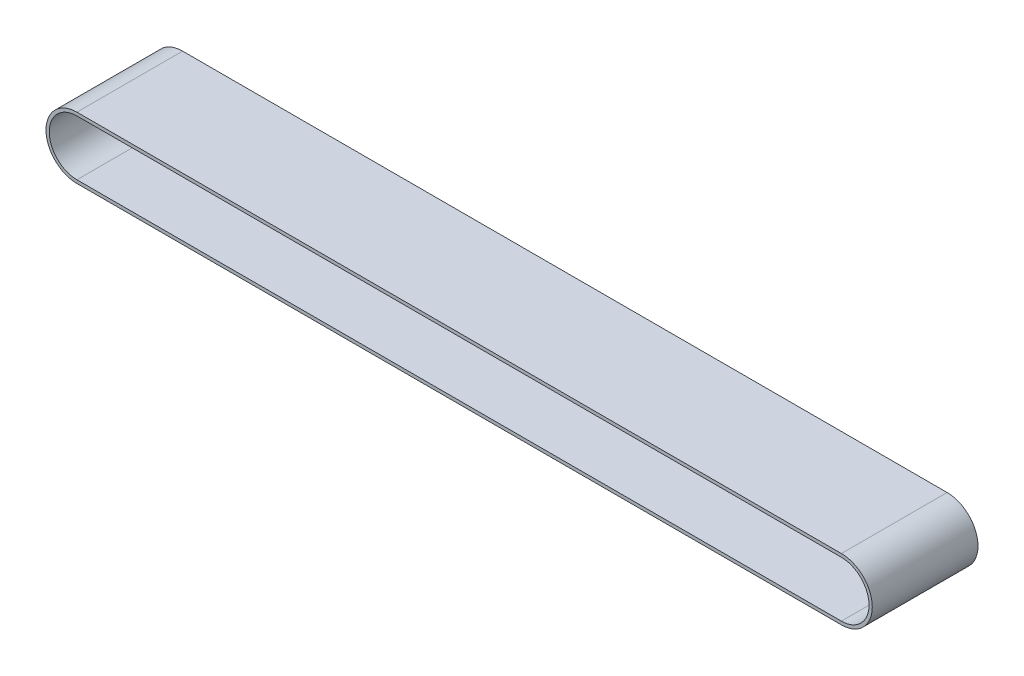
ISO-10303-21;
HEADER;
FILE_DESCRIPTION(('STEP AP214'),'2;1');
FILE_NAME('part.step','',(''),(''),'','','');
FILE_SCHEMA(('AUTOMOTIVE_DESIGN { 1 0 10303 214 1 1 1 1 }'));
ENDSEC;
DATA;
#1=APPLICATION_CONTEXT('core data for automotive mechanical design processes');
#2=APPLICATION_PROTOCOL_DEFINITION('international standard','automotive_design',2000,#1);
#3=PRODUCT_CONTEXT('',#1,'mechanical');
#4=PRODUCT('Part','Part','',(#3));
#5=PRODUCT_RELATED_PRODUCT_CATEGORY('part','',(#4));
#6=PRODUCT_DEFINITION_FORMATION('','',#4);
#7=PRODUCT_DEFINITION_CONTEXT('part definition',#1,'design');
#8=PRODUCT_DEFINITION('design','',#6,#7);
#9=PRODUCT_DEFINITION_SHAPE('','',#8);
#10=(LENGTH_UNIT() NAMED_UNIT(*) SI_UNIT(.MILLI.,.METRE.));
#11=(NAMED_UNIT(*) PLANE_ANGLE_UNIT() SI_UNIT($,.RADIAN.));
#12=(NAMED_UNIT(*) SI_UNIT($,.STERADIAN.) SOLID_ANGLE_UNIT());
#13=UNCERTAINTY_MEASURE_WITH_UNIT(LENGTH_MEASURE(1.E-05),#10,'distance_accuracy_value','');
#14=(GEOMETRIC_REPRESENTATION_CONTEXT(3) GLOBAL_UNCERTAINTY_ASSIGNED_CONTEXT((#13)) GLOBAL_UNIT_ASSIGNED_CONTEXT((#10,
#11,#12)) REPRESENTATION_CONTEXT('',''));
#15=CARTESIAN_POINT('',(0.,0.,0.));
#16=DIRECTION('',(0.,0.,1.));
#17=DIRECTION('',(1.,0.,0.));
#18=AXIS2_PLACEMENT_3D('',#15,#16,#17);
#19=CARTESIAN_POINT('',(0.,0.,0.));
#20=DIRECTION('',(0.,0.,1.));
#21=DIRECTION('',(1.,0.,0.));
#22=AXIS2_PLACEMENT_3D('',#19,#20,#21);
#23=PLANE('',#22);
#24=DIRECTION('',(-1.,0.,0.));
#25=VECTOR('',#24,1.);
#26=CARTESIAN_POINT('',(0.,17.,0.));
#27=LINE('',#26,#25);
#28=CARTESIAN_POINT('',(470.,17.,0.));
#29=VERTEX_POINT('',#28);
#30=CARTESIAN_POINT('',(0.,17.,0.));
#31=VERTEX_POINT('',#30);
#32=EDGE_CURVE('E41',#29,#31,#27,.T.);
#33=ORIENTED_EDGE('',*,*,#32,.T.);
#34=CARTESIAN_POINT('',(0.,0.,0.));
#35=DIRECTION('',(0.,0.,1.));
#36=DIRECTION('',(1.,0.,0.));
#37=AXIS2_PLACEMENT_3D('',#34,#35,#36);
#38=CIRCLE('',#37,17.);
#39=CARTESIAN_POINT('',(0.,-17.,0.));
#40=VERTEX_POINT('',#39);
#41=EDGE_CURVE('E11',#31,#40,#38,.T.);
#42=ORIENTED_EDGE('',*,*,#41,.T.);
#43=DIRECTION('',(1.,0.,0.));
#44=VECTOR('',#43,1.);
#45=CARTESIAN_POINT('',(0.,-17.,0.));
#46=LINE('',#45,#44);
#47=CARTESIAN_POINT('',(470.,-17.,0.));
#48=VERTEX_POINT('',#47);
#49=EDGE_CURVE('E147',#40,#48,#46,.T.);
#50=ORIENTED_EDGE('',*,*,#49,.T.);
#51=CARTESIAN_POINT('',(470.,0.,0.));
#52=DIRECTION('',(0.,0.,1.));
#53=DIRECTION('',(1.,0.,0.));
#54=AXIS2_PLACEMENT_3D('',#51,#52,#53);
#55=CIRCLE('',#54,17.);
#56=EDGE_CURVE('E156',#48,#29,#55,.T.);
#57=ORIENTED_EDGE('',*,*,#56,.T.);
#58=EDGE_LOOP('',(#33,#42,#50,#57));
#59=FACE_BOUND('',#58,.T.);
#60=CARTESIAN_POINT('',(0.,0.,0.));
#61=DIRECTION('',(0.,0.,1.));
#62=DIRECTION('',(1.,0.,0.));
#63=AXIS2_PLACEMENT_3D('',#60,#61,#62);
#64=CIRCLE('',#63,19.);
#65=CARTESIAN_POINT('',(0.,19.,0.));
#66=VERTEX_POINT('',#65);
#67=CARTESIAN_POINT('',(0.,-19.,0.));
#68=VERTEX_POINT('',#67);
#69=EDGE_CURVE('E131',#66,#68,#64,.T.);
#70=ORIENTED_EDGE('',*,*,#69,.F.);
#71=DIRECTION('',(-1.,0.,0.));
#72=VECTOR('',#71,1.);
#73=CARTESIAN_POINT('',(0.,19.,0.));
#74=LINE('',#73,#72);
#75=CARTESIAN_POINT('',(470.,19.,0.));
#76=VERTEX_POINT('',#75);
#77=EDGE_CURVE('E129',#76,#66,#74,.T.);
#78=ORIENTED_EDGE('',*,*,#77,.F.);
#79=CARTESIAN_POINT('',(470.,0.,0.));
#80=DIRECTION('',(0.,0.,1.));
#81=DIRECTION('',(1.,0.,0.));
#82=AXIS2_PLACEMENT_3D('',#79,#80,#81);
#83=CIRCLE('',#82,19.);
#84=CARTESIAN_POINT('',(470.,-19.,0.));
#85=VERTEX_POINT('',#84);
#86=EDGE_CURVE('E101',#85,#76,#83,.T.);
#87=ORIENTED_EDGE('',*,*,#86,.F.);
#88=DIRECTION('',(1.,0.,0.));
#89=VECTOR('',#88,1.);
#90=CARTESIAN_POINT('',(0.,-19.,0.));
#91=LINE('',#90,#89);
#92=EDGE_CURVE('E123',#68,#85,#91,.T.);
#93=ORIENTED_EDGE('',*,*,#92,.F.);
#94=EDGE_LOOP('',(#70,#78,#87,#93));
#95=FACE_BOUND('',#94,.T.);
#96=ADVANCED_FACE('F34',(#59,#95),#23,.F.);
#97=CARTESIAN_POINT('',(0.,0.,65.));
#98=DIRECTION('',(0.,0.,1.));
#99=DIRECTION('',(1.,0.,0.));
#100=AXIS2_PLACEMENT_3D('',#97,#98,#99);
#101=PLANE('',#100);
#102=CARTESIAN_POINT('',(0.,0.,65.));
#103=DIRECTION('',(0.,0.,1.));
#104=DIRECTION('',(1.,0.,0.));
#105=AXIS2_PLACEMENT_3D('',#102,#103,#104);
#106=CIRCLE('',#105,17.);
#107=CARTESIAN_POINT('',(0.,17.,65.));
#108=VERTEX_POINT('',#107);
#109=CARTESIAN_POINT('',(0.,-17.,65.));
#110=VERTEX_POINT('',#109);
#111=EDGE_CURVE('E133',#108,#110,#106,.T.);
#112=ORIENTED_EDGE('',*,*,#111,.F.);
#113=DIRECTION('',(-1.,0.,0.));
#114=VECTOR('',#113,1.);
#115=CARTESIAN_POINT('',(470.,17.,65.));
#116=LINE('',#115,#114);
#117=CARTESIAN_POINT('',(470.,17.,65.));
#118=VERTEX_POINT('',#117);
#119=EDGE_CURVE('E141',#118,#108,#116,.T.);
#120=ORIENTED_EDGE('',*,*,#119,.F.);
#121=CARTESIAN_POINT('',(470.,0.,65.));
#122=DIRECTION('',(0.,0.,1.));
#123=DIRECTION('',(1.,0.,0.));
#124=AXIS2_PLACEMENT_3D('',#121,#122,#123);
#125=CIRCLE('',#124,17.);
#126=CARTESIAN_POINT('',(470.,-17.,65.));
#127=VERTEX_POINT('',#126);
#128=EDGE_CURVE('E138',#127,#118,#125,.T.);
#129=ORIENTED_EDGE('',*,*,#128,.F.);
#130=DIRECTION('',(1.,0.,0.));
#131=VECTOR('',#130,1.);
#132=CARTESIAN_POINT('',(0.,-17.,65.));
#133=LINE('',#132,#131);
#134=EDGE_CURVE('E135',#110,#127,#133,.T.);
#135=ORIENTED_EDGE('',*,*,#134,.F.);
#136=EDGE_LOOP('',(#112,#120,#129,#135));
#137=FACE_BOUND('',#136,.T.);
#138=DIRECTION('',(-1.,0.,0.));
#139=VECTOR('',#138,1.);
#140=CARTESIAN_POINT('',(0.,19.,65.));
#141=LINE('',#140,#139);
#142=CARTESIAN_POINT('',(470.,19.,65.));
#143=VERTEX_POINT('',#142);
#144=CARTESIAN_POINT('',(0.,19.,65.));
#145=VERTEX_POINT('',#144);
#146=EDGE_CURVE('E108',#143,#145,#141,.T.);
#147=ORIENTED_EDGE('',*,*,#146,.T.);
#148=CARTESIAN_POINT('',(0.,0.,65.));
#149=DIRECTION('',(0.,0.,1.));
#150=DIRECTION('',(1.,0.,0.));
#151=AXIS2_PLACEMENT_3D('',#148,#149,#150);
#152=CIRCLE('',#151,19.);
#153=CARTESIAN_POINT('',(0.,-19.,65.));
#154=VERTEX_POINT('',#153);
#155=EDGE_CURVE('E119',#145,#154,#152,.T.);
#156=ORIENTED_EDGE('',*,*,#155,.T.);
#157=DIRECTION('',(1.,0.,0.));
#158=VECTOR('',#157,1.);
#159=CARTESIAN_POINT('',(0.,-19.,65.));
#160=LINE('',#159,#158);
#161=CARTESIAN_POINT('',(470.,-19.,65.));
#162=VERTEX_POINT('',#161);
#163=EDGE_CURVE('E117',#154,#162,#160,.T.);
#164=ORIENTED_EDGE('',*,*,#163,.T.);
#165=CARTESIAN_POINT('',(470.,0.,65.));
#166=DIRECTION('',(0.,0.,1.));
#167=DIRECTION('',(1.,0.,0.));
#168=AXIS2_PLACEMENT_3D('',#165,#166,#167);
#169=CIRCLE('',#168,19.);
#170=EDGE_CURVE('E56',#162,#143,#169,.T.);
#171=ORIENTED_EDGE('',*,*,#170,.T.);
#172=EDGE_LOOP('',(#147,#156,#164,#171));
#173=FACE_BOUND('',#172,.T.);
#174=ADVANCED_FACE('F116',(#137,#173),#101,.T.);
#175=CARTESIAN_POINT('',(0.,0.,-160.));
#176=DIRECTION('',(0.,0.,1.));
#177=DIRECTION('',(1.,0.,0.));
#178=AXIS2_PLACEMENT_3D('',#175,#176,#177);
#179=CYLINDRICAL_SURFACE('',#178,17.);
#180=DIRECTION('',(0.,0.,1.));
#181=VECTOR('',#180,1.);
#182=CARTESIAN_POINT('',(0.,17.,-160.));
#183=LINE('',#182,#181);
#184=EDGE_CURVE('E145',#31,#108,#183,.T.);
#185=ORIENTED_EDGE('',*,*,#184,.T.);
#186=ORIENTED_EDGE('',*,*,#111,.T.);
#187=DIRECTION('',(0.,0.,1.));
#188=VECTOR('',#187,1.);
#189=CARTESIAN_POINT('',(0.,-17.,-160.));
#190=LINE('',#189,#188);
#191=EDGE_CURVE('E144',#40,#110,#190,.T.);
#192=ORIENTED_EDGE('',*,*,#191,.F.);
#193=ORIENTED_EDGE('',*,*,#41,.F.);
#194=EDGE_LOOP('',(#185,#186,#192,#193));
#195=FACE_BOUND('',#194,.T.);
#196=ADVANCED_FACE('F175',(#195),#179,.F.);
#197=CARTESIAN_POINT('',(470.,17.,-160.));
#198=DIRECTION('',(0.,1.,0.));
#199=DIRECTION('',(-1.,0.,0.));
#200=AXIS2_PLACEMENT_3D('',#197,#198,#199);
#201=PLANE('',#200);
#202=DIRECTION('',(0.,0.,1.));
#203=VECTOR('',#202,1.);
#204=CARTESIAN_POINT('',(470.,17.,-160.));
#205=LINE('',#204,#203);
#206=EDGE_CURVE('E148',#29,#118,#205,.T.);
#207=ORIENTED_EDGE('',*,*,#206,.T.);
#208=ORIENTED_EDGE('',*,*,#119,.T.);
#209=ORIENTED_EDGE('',*,*,#184,.F.);
#210=ORIENTED_EDGE('',*,*,#32,.F.);
#211=EDGE_LOOP('',(#207,#208,#209,#210));
#212=FACE_BOUND('',#211,.T.);
#213=ADVANCED_FACE('F165',(#212),#201,.F.);
#214=CARTESIAN_POINT('',(470.,0.,-160.));
#215=DIRECTION('',(0.,0.,1.));
#216=DIRECTION('',(1.,0.,0.));
#217=AXIS2_PLACEMENT_3D('',#214,#215,#216);
#218=CYLINDRICAL_SURFACE('',#217,17.);
#219=DIRECTION('',(0.,0.,1.));
#220=VECTOR('',#219,1.);
#221=CARTESIAN_POINT('',(470.,-17.,-160.));
#222=LINE('',#221,#220);
#223=EDGE_CURVE('E150',#48,#127,#222,.T.);
#224=ORIENTED_EDGE('',*,*,#223,.T.);
#225=ORIENTED_EDGE('',*,*,#128,.T.);
#226=ORIENTED_EDGE('',*,*,#206,.F.);
#227=ORIENTED_EDGE('',*,*,#56,.F.);
#228=EDGE_LOOP('',(#224,#225,#226,#227));
#229=FACE_BOUND('',#228,.T.);
#230=ADVANCED_FACE('F167',(#229),#218,.F.);
#231=CARTESIAN_POINT('',(0.,-17.,-160.));
#232=DIRECTION('',(0.,-1.,0.));
#233=DIRECTION('',(1.,0.,0.));
#234=AXIS2_PLACEMENT_3D('',#231,#232,#233);
#235=PLANE('',#234);
#236=ORIENTED_EDGE('',*,*,#191,.T.);
#237=ORIENTED_EDGE('',*,*,#134,.T.);
#238=ORIENTED_EDGE('',*,*,#223,.F.);
#239=ORIENTED_EDGE('',*,*,#49,.F.);
#240=EDGE_LOOP('',(#236,#237,#238,#239));
#241=FACE_BOUND('',#240,.T.);
#242=ADVANCED_FACE('F177',(#241),#235,.F.);
#243=CARTESIAN_POINT('',(0.,0.,-160.));
#244=DIRECTION('',(0.,0.,1.));
#245=DIRECTION('',(1.,0.,0.));
#246=AXIS2_PLACEMENT_3D('',#243,#244,#245);
#247=CYLINDRICAL_SURFACE('',#246,19.);
#248=ORIENTED_EDGE('',*,*,#69,.T.);
#249=DIRECTION('',(0.,0.,1.));
#250=VECTOR('',#249,1.);
#251=CARTESIAN_POINT('',(0.,-19.,-160.));
#252=LINE('',#251,#250);
#253=EDGE_CURVE('E48',#68,#154,#252,.T.);
#254=ORIENTED_EDGE('',*,*,#253,.T.);
#255=ORIENTED_EDGE('',*,*,#155,.F.);
#256=DIRECTION('',(0.,0.,1.));
#257=VECTOR('',#256,1.);
#258=CARTESIAN_POINT('',(0.,19.,-160.));
#259=LINE('',#258,#257);
#260=EDGE_CURVE('E104',#66,#145,#259,.T.);
#261=ORIENTED_EDGE('',*,*,#260,.F.);
#262=EDGE_LOOP('',(#248,#254,#255,#261));
#263=FACE_BOUND('',#262,.T.);
#264=ADVANCED_FACE('F179',(#263),#247,.T.);
#265=CARTESIAN_POINT('',(0.,19.,-160.));
#266=DIRECTION('',(0.,1.,0.));
#267=DIRECTION('',(0.,0.,1.));
#268=AXIS2_PLACEMENT_3D('',#265,#266,#267);
#269=PLANE('',#268);
#270=ORIENTED_EDGE('',*,*,#77,.T.);
#271=ORIENTED_EDGE('',*,*,#260,.T.);
#272=ORIENTED_EDGE('',*,*,#146,.F.);
#273=DIRECTION('',(0.,0.,1.));
#274=VECTOR('',#273,1.);
#275=CARTESIAN_POINT('',(470.,19.,-160.));
#276=LINE('',#275,#274);
#277=EDGE_CURVE('E97',#76,#143,#276,.T.);
#278=ORIENTED_EDGE('',*,*,#277,.F.);
#279=EDGE_LOOP('',(#270,#271,#272,#278));
#280=FACE_BOUND('',#279,.T.);
#281=ADVANCED_FACE('F109',(#280),#269,.T.);
#282=CARTESIAN_POINT('',(470.,0.,-160.));
#283=DIRECTION('',(0.,0.,1.));
#284=DIRECTION('',(1.,0.,0.));
#285=AXIS2_PLACEMENT_3D('',#282,#283,#284);
#286=CYLINDRICAL_SURFACE('',#285,19.);
#287=ORIENTED_EDGE('',*,*,#86,.T.);
#288=ORIENTED_EDGE('',*,*,#277,.T.);
#289=ORIENTED_EDGE('',*,*,#170,.F.);
#290=DIRECTION('',(0.,0.,1.));
#291=VECTOR('',#290,1.);
#292=CARTESIAN_POINT('',(470.,-19.,-160.));
#293=LINE('',#292,#291);
#294=EDGE_CURVE('E105',#85,#162,#293,.T.);
#295=ORIENTED_EDGE('',*,*,#294,.F.);
#296=EDGE_LOOP('',(#287,#288,#289,#295));
#297=FACE_BOUND('',#296,.T.);
#298=ADVANCED_FACE('F99',(#297),#286,.T.);
#299=CARTESIAN_POINT('',(0.,-19.,-160.));
#300=DIRECTION('',(0.,-1.,0.));
#301=DIRECTION('',(0.,0.,-1.));
#302=AXIS2_PLACEMENT_3D('',#299,#300,#301);
#303=PLANE('',#302);
#304=ORIENTED_EDGE('',*,*,#92,.T.);
#305=ORIENTED_EDGE('',*,*,#294,.T.);
#306=ORIENTED_EDGE('',*,*,#163,.F.);
#307=ORIENTED_EDGE('',*,*,#253,.F.);
#308=EDGE_LOOP('',(#304,#305,#306,#307));
#309=FACE_BOUND('',#308,.T.);
#310=ADVANCED_FACE('F203',(#309),#303,.T.);
#311=CLOSED_SHELL('',(#96,#174,#196,#213,#230,#242,#264,#281,#298,#310));
#312=MANIFOLD_SOLID_BREP('B2',#311);
#313=ADVANCED_BREP_SHAPE_REPRESENTATION('',(#18,#312),#14);
#314=SHAPE_DEFINITION_REPRESENTATION(#9,#313);
ENDSEC;
END-ISO-10303-21;
